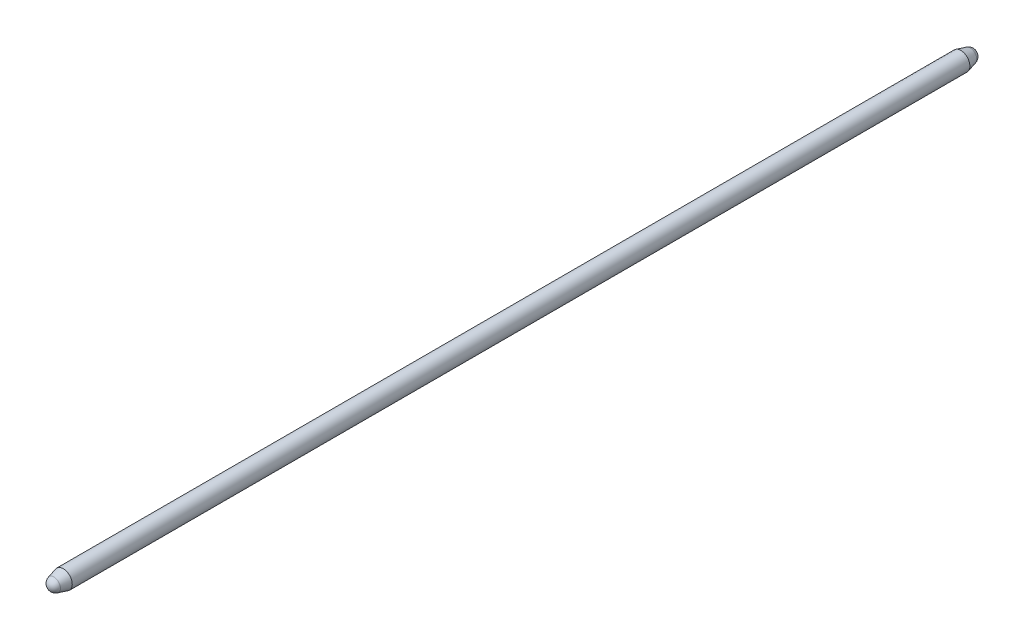
ISO-10303-21;
HEADER;
FILE_DESCRIPTION(('STEP AP214'),'2;1');
FILE_NAME('part.step','',(''),(''),'','','');
FILE_SCHEMA(('AUTOMOTIVE_DESIGN { 1 0 10303 214 1 1 1 1 }'));
ENDSEC;
DATA;
#1=APPLICATION_CONTEXT('core data for automotive mechanical design processes');
#2=APPLICATION_PROTOCOL_DEFINITION('international standard','automotive_design',2000,#1);
#3=PRODUCT_CONTEXT('',#1,'mechanical');
#4=PRODUCT('Part','Part','',(#3));
#5=PRODUCT_RELATED_PRODUCT_CATEGORY('part','',(#4));
#6=PRODUCT_DEFINITION_FORMATION('','',#4);
#7=PRODUCT_DEFINITION_CONTEXT('part definition',#1,'design');
#8=PRODUCT_DEFINITION('design','',#6,#7);
#9=PRODUCT_DEFINITION_SHAPE('','',#8);
#10=(LENGTH_UNIT() NAMED_UNIT(*) SI_UNIT(.MILLI.,.METRE.));
#11=(NAMED_UNIT(*) PLANE_ANGLE_UNIT() SI_UNIT($,.RADIAN.));
#12=(NAMED_UNIT(*) SI_UNIT($,.STERADIAN.) SOLID_ANGLE_UNIT());
#13=UNCERTAINTY_MEASURE_WITH_UNIT(LENGTH_MEASURE(1.E-05),#10,'distance_accuracy_value','');
#14=(GEOMETRIC_REPRESENTATION_CONTEXT(3) GLOBAL_UNCERTAINTY_ASSIGNED_CONTEXT((#13)) GLOBAL_UNIT_ASSIGNED_CONTEXT((#10,
#11,#12)) REPRESENTATION_CONTEXT('',''));
#15=CARTESIAN_POINT('',(0.,0.,0.));
#16=DIRECTION('',(0.,0.,1.));
#17=DIRECTION('',(1.,0.,0.));
#18=AXIS2_PLACEMENT_3D('',#15,#16,#17);
#19=CARTESIAN_POINT('',(0.,0.,-1276.52483439663));
#20=DIRECTION('',(0.,0.,-1.));
#21=DIRECTION('',(0.,1.,0.));
#22=AXIS2_PLACEMENT_3D('',#19,#20,#21);
#23=SPHERICAL_SURFACE('',#22,19.05);
#24=CARTESIAN_POINT('',(0.,0.,-1281.45533720584));
#25=DIRECTION('',(0.,0.,-1.));
#26=DIRECTION('',(0.,1.,0.));
#27=AXIS2_PLACEMENT_3D('',#24,#25,#26);
#28=CIRCLE('',#27,18.4008869908067);
#29=CARTESIAN_POINT('',(0.,18.4008869908068,-1281.45533720584));
#30=VERTEX_POINT('',#29);
#31=EDGE_CURVE('E10',#30,#30,#28,.T.);
#32=ORIENTED_EDGE('',*,*,#31,.T.);
#33=EDGE_LOOP('',(#32));
#34=FACE_BOUND('',#33,.T.);
#35=ADVANCED_FACE('F31',(#34),#23,.T.);
#36=CARTESIAN_POINT('',(0.,0.,-1281.45533720584));
#37=DIRECTION('',(0.,0.,1.));
#38=DIRECTION('',(0.,-1.,0.));
#39=AXIS2_PLACEMENT_3D('',#36,#37,#38);
#40=CONICAL_SURFACE('',#39,18.4008869908067,0.26179938779915);
#41=CARTESIAN_POINT('',(0.,0.,-1255.33429184761));
#42=DIRECTION('',(0.,0.,-1.));
#43=DIRECTION('',(0.,1.,0.));
#44=AXIS2_PLACEMENT_3D('',#41,#42,#43);
#45=CIRCLE('',#44,25.4);
#46=CARTESIAN_POINT('',(0.,25.4,-1255.33429184761));
#47=VERTEX_POINT('',#46);
#48=EDGE_CURVE('E38',#47,#47,#45,.T.);
#49=ORIENTED_EDGE('',*,*,#48,.T.);
#50=EDGE_LOOP('',(#49));
#51=FACE_BOUND('',#50,.T.);
#52=ORIENTED_EDGE('',*,*,#31,.F.);
#53=EDGE_LOOP('',(#52));
#54=FACE_BOUND('',#53,.T.);
#55=ADVANCED_FACE('F86',(#51,#54),#40,.T.);
#56=CARTESIAN_POINT('',(0.,0.,-1295.57483439663));
#57=DIRECTION('',(0.,0.,-1.));
#58=DIRECTION('',(0.,1.,0.));
#59=AXIS2_PLACEMENT_3D('',#56,#57,#58);
#60=CYLINDRICAL_SURFACE('',#59,25.4);
#61=CARTESIAN_POINT('',(0.,0.,1255.33429184761));
#62=DIRECTION('',(0.,0.,-1.));
#63=DIRECTION('',(0.,1.,0.));
#64=AXIS2_PLACEMENT_3D('',#61,#62,#63);
#65=CIRCLE('',#64,25.4);
#66=CARTESIAN_POINT('',(0.,25.4,1255.33429184761));
#67=VERTEX_POINT('',#66);
#68=EDGE_CURVE('E42',#67,#67,#65,.T.);
#69=ORIENTED_EDGE('',*,*,#68,.T.);
#70=EDGE_LOOP('',(#69));
#71=FACE_BOUND('',#70,.T.);
#72=ORIENTED_EDGE('',*,*,#48,.F.);
#73=EDGE_LOOP('',(#72));
#74=FACE_BOUND('',#73,.T.);
#75=ADVANCED_FACE('F83',(#71,#74),#60,.T.);
#76=CARTESIAN_POINT('',(0.,0.,1255.33429184761));
#77=DIRECTION('',(0.,0.,-1.));
#78=DIRECTION('',(0.,1.,0.));
#79=AXIS2_PLACEMENT_3D('',#76,#77,#78);
#80=CONICAL_SURFACE('',#79,25.4,0.26179938779915);
#81=CARTESIAN_POINT('',(0.,0.,1281.45533720584));
#82=DIRECTION('',(0.,0.,-1.));
#83=DIRECTION('',(0.,1.,0.));
#84=AXIS2_PLACEMENT_3D('',#81,#82,#83);
#85=CIRCLE('',#84,18.4008869908068);
#86=CARTESIAN_POINT('',(0.,18.4008869908068,1281.45533720584));
#87=VERTEX_POINT('',#86);
#88=EDGE_CURVE('E46',#87,#87,#85,.T.);
#89=ORIENTED_EDGE('',*,*,#88,.T.);
#90=EDGE_LOOP('',(#89));
#91=FACE_BOUND('',#90,.T.);
#92=ORIENTED_EDGE('',*,*,#68,.F.);
#93=EDGE_LOOP('',(#92));
#94=FACE_BOUND('',#93,.T.);
#95=ADVANCED_FACE('F79',(#91,#94),#80,.T.);
#96=CARTESIAN_POINT('',(0.,0.,1276.52483439663));
#97=DIRECTION('',(0.,0.,-1.));
#98=DIRECTION('',(0.,1.,0.));
#99=AXIS2_PLACEMENT_3D('',#96,#97,#98);
#100=SPHERICAL_SURFACE('',#99,19.05);
#101=ORIENTED_EDGE('',*,*,#88,.F.);
#102=EDGE_LOOP('',(#101));
#103=FACE_BOUND('',#102,.T.);
#104=ADVANCED_FACE('F77',(#103),#100,.T.);
#105=CLOSED_SHELL('',(#35,#55,#75,#95,#104));
#106=CARTESIAN_POINT('',(0.,0.,1255.33429184761));
#107=DIRECTION('',(0.,0.,-1.));
#108=DIRECTION('',(0.,1.,0.));
#109=AXIS2_PLACEMENT_3D('',#106,#107,#108);
#110=PLANE('',#109);
#111=CARTESIAN_POINT('',(0.,0.,1255.33429184761));
#112=DIRECTION('',(0.,0.,-1.));
#113=DIRECTION('',(0.,1.,0.));
#114=AXIS2_PLACEMENT_3D('',#111,#112,#113);
#115=CIRCLE('',#114,22.987);
#116=CARTESIAN_POINT('',(0.,22.987,1255.33429184761));
#117=VERTEX_POINT('',#116);
#118=EDGE_CURVE('E51',#117,#117,#115,.T.);
#119=ORIENTED_EDGE('',*,*,#118,.T.);
#120=EDGE_LOOP('',(#119));
#121=FACE_BOUND('',#120,.T.);
#122=ADVANCED_FACE('F68',(#121),#110,.T.);
#123=CARTESIAN_POINT('',(0.,0.,-1295.57483439663));
#124=DIRECTION('',(0.,0.,-1.));
#125=DIRECTION('',(0.,1.,0.));
#126=AXIS2_PLACEMENT_3D('',#123,#124,#125);
#127=CYLINDRICAL_SURFACE('',#126,22.987);
#128=CARTESIAN_POINT('',(0.,0.,-1255.33429184761));
#129=DIRECTION('',(0.,0.,-1.));
#130=DIRECTION('',(0.,1.,0.));
#131=AXIS2_PLACEMENT_3D('',#128,#129,#130);
#132=CIRCLE('',#131,22.987);
#133=CARTESIAN_POINT('',(0.,22.987,-1255.33429184761));
#134=VERTEX_POINT('',#133);
#135=EDGE_CURVE('E54',#134,#134,#132,.T.);
#136=ORIENTED_EDGE('',*,*,#135,.T.);
#137=EDGE_LOOP('',(#136));
#138=FACE_BOUND('',#137,.T.);
#139=ORIENTED_EDGE('',*,*,#118,.F.);
#140=EDGE_LOOP('',(#139));
#141=FACE_BOUND('',#140,.T.);
#142=ADVANCED_FACE('F58',(#138,#141),#127,.F.);
#143=CARTESIAN_POINT('',(0.,0.,-1255.33429184761));
#144=DIRECTION('',(0.,0.,1.));
#145=DIRECTION('',(0.,-1.,0.));
#146=AXIS2_PLACEMENT_3D('',#143,#144,#145);
#147=PLANE('',#146);
#148=ORIENTED_EDGE('',*,*,#135,.F.);
#149=EDGE_LOOP('',(#148));
#150=FACE_BOUND('',#149,.T.);
#151=ADVANCED_FACE('F61',(#150),#147,.T.);
#152=CLOSED_SHELL('',(#122,#142,#151));
#153=ORIENTED_CLOSED_SHELL('',*,#152,.T.);
#154=BREP_WITH_VOIDS('B2',#105,(#153));
#155=ADVANCED_BREP_SHAPE_REPRESENTATION('',(#18,#154),#14);
#156=SHAPE_DEFINITION_REPRESENTATION(#9,#155);
ENDSEC;
END-ISO-10303-21;
